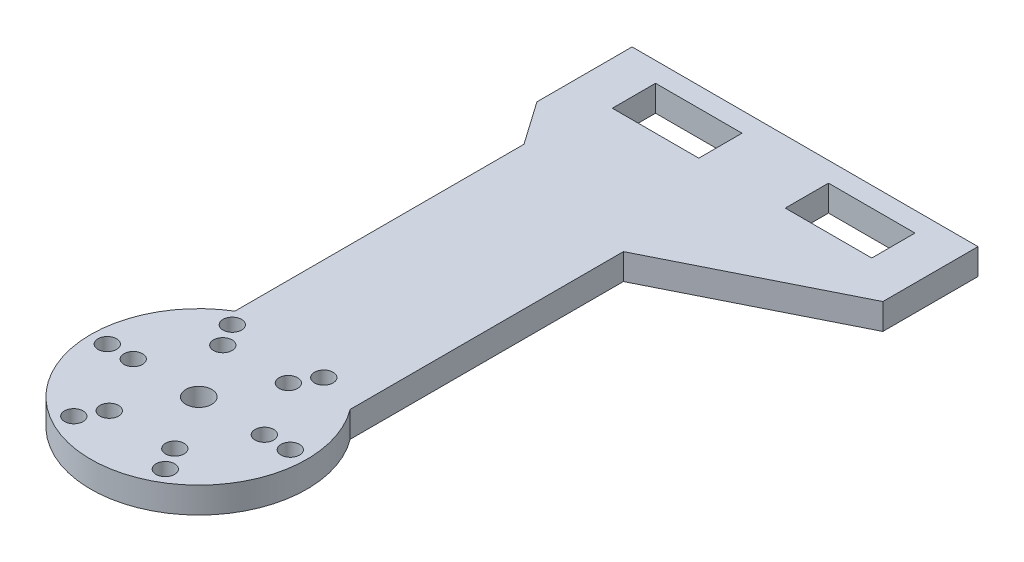
ISO-10303-21;
HEADER;
FILE_DESCRIPTION(('STEP AP214'),'2;1');
FILE_NAME('part.step','',(''),(''),'','','');
FILE_SCHEMA(('AUTOMOTIVE_DESIGN { 1 0 10303 214 1 1 1 1 }'));
ENDSEC;
DATA;
#1=APPLICATION_CONTEXT('core data for automotive mechanical design processes');
#2=APPLICATION_PROTOCOL_DEFINITION('international standard','automotive_design',2000,#1);
#3=PRODUCT_CONTEXT('',#1,'mechanical');
#4=PRODUCT('Part','Part','',(#3));
#5=PRODUCT_RELATED_PRODUCT_CATEGORY('part','',(#4));
#6=PRODUCT_DEFINITION_FORMATION('','',#4);
#7=PRODUCT_DEFINITION_CONTEXT('part definition',#1,'design');
#8=PRODUCT_DEFINITION('design','',#6,#7);
#9=PRODUCT_DEFINITION_SHAPE('','',#8);
#10=(LENGTH_UNIT() NAMED_UNIT(*) SI_UNIT(.MILLI.,.METRE.));
#11=(NAMED_UNIT(*) PLANE_ANGLE_UNIT() SI_UNIT($,.RADIAN.));
#12=(NAMED_UNIT(*) SI_UNIT($,.STERADIAN.) SOLID_ANGLE_UNIT());
#13=UNCERTAINTY_MEASURE_WITH_UNIT(LENGTH_MEASURE(1.E-05),#10,'distance_accuracy_value','');
#14=(GEOMETRIC_REPRESENTATION_CONTEXT(3) GLOBAL_UNCERTAINTY_ASSIGNED_CONTEXT((#13)) GLOBAL_UNIT_ASSIGNED_CONTEXT((#10,
#11,#12)) REPRESENTATION_CONTEXT('',''));
#15=CARTESIAN_POINT('',(0.,0.,0.));
#16=DIRECTION('',(0.,0.,1.));
#17=DIRECTION('',(1.,0.,0.));
#18=AXIS2_PLACEMENT_3D('',#15,#16,#17);
#19=CARTESIAN_POINT('',(0.,3.,0.));
#20=DIRECTION('',(0.,1.,0.));
#21=DIRECTION('',(0.,0.,1.));
#22=AXIS2_PLACEMENT_3D('',#19,#20,#21);
#23=PLANE('',#22);
#24=DIRECTION('',(0.,0.,1.));
#25=VECTOR('',#24,1.);
#26=CARTESIAN_POINT('',(15.,3.,-57.8141926587171));
#27=LINE('',#26,#25);
#28=CARTESIAN_POINT('',(15.,3.,-57.8141926587171));
#29=VERTEX_POINT('',#28);
#30=CARTESIAN_POINT('',(15.,3.,-52.8141926587171));
#31=VERTEX_POINT('',#30);
#32=EDGE_CURVE('E162',#29,#31,#27,.T.);
#33=ORIENTED_EDGE('',*,*,#32,.F.);
#34=DIRECTION('',(-1.,0.,0.));
#35=VECTOR('',#34,1.);
#36=CARTESIAN_POINT('',(25.,3.,-57.8141926587171));
#37=LINE('',#36,#35);
#38=CARTESIAN_POINT('',(25.,3.,-57.8141926587171));
#39=VERTEX_POINT('',#38);
#40=EDGE_CURVE('E153',#39,#29,#37,.T.);
#41=ORIENTED_EDGE('',*,*,#40,.F.);
#42=DIRECTION('',(0.,0.,-1.));
#43=VECTOR('',#42,1.);
#44=CARTESIAN_POINT('',(25.,3.,-52.8141926587171));
#45=LINE('',#44,#43);
#46=CARTESIAN_POINT('',(25.,3.,-52.8141926587171));
#47=VERTEX_POINT('',#46);
#48=EDGE_CURVE('E180',#47,#39,#45,.T.);
#49=ORIENTED_EDGE('',*,*,#48,.F.);
#50=DIRECTION('',(1.,0.,0.));
#51=VECTOR('',#50,1.);
#52=CARTESIAN_POINT('',(15.,3.,-52.8141926587171));
#53=LINE('',#52,#51);
#54=EDGE_CURVE('E176',#31,#47,#53,.T.);
#55=ORIENTED_EDGE('',*,*,#54,.F.);
#56=EDGE_LOOP('',(#33,#41,#49,#55));
#57=FACE_BOUND('',#56,.T.);
#58=DIRECTION('',(0.,0.,1.));
#59=VECTOR('',#58,1.);
#60=CARTESIAN_POINT('',(-5.00000000000001,3.,-57.8141926587171));
#61=LINE('',#60,#59);
#62=CARTESIAN_POINT('',(-5.00000000000001,3.,-57.8141926587171));
#63=VERTEX_POINT('',#62);
#64=CARTESIAN_POINT('',(-5.00000000000001,3.,-52.8141926587171));
#65=VERTEX_POINT('',#64);
#66=EDGE_CURVE('E207',#63,#65,#61,.T.);
#67=ORIENTED_EDGE('',*,*,#66,.F.);
#68=DIRECTION('',(-1.,0.,0.));
#69=VECTOR('',#68,1.);
#70=CARTESIAN_POINT('',(-5.00000000000001,3.,-57.8141926587171));
#71=LINE('',#70,#69);
#72=CARTESIAN_POINT('',(4.99999999999999,3.,-57.8141926587171));
#73=VERTEX_POINT('',#72);
#74=EDGE_CURVE('E204',#73,#63,#71,.T.);
#75=ORIENTED_EDGE('',*,*,#74,.F.);
#76=DIRECTION('',(0.,0.,-1.));
#77=VECTOR('',#76,1.);
#78=CARTESIAN_POINT('',(4.99999999999999,3.,-52.8141926587171));
#79=LINE('',#78,#77);
#80=CARTESIAN_POINT('',(4.99999999999999,3.,-52.8141926587171));
#81=VERTEX_POINT('',#80);
#82=EDGE_CURVE('E215',#81,#73,#79,.T.);
#83=ORIENTED_EDGE('',*,*,#82,.F.);
#84=DIRECTION('',(1.,0.,0.));
#85=VECTOR('',#84,1.);
#86=CARTESIAN_POINT('',(-5.00000000000001,3.,-52.8141926587171));
#87=LINE('',#86,#85);
#88=EDGE_CURVE('E211',#65,#81,#87,.T.);
#89=ORIENTED_EDGE('',*,*,#88,.F.);
#90=EDGE_LOOP('',(#67,#75,#83,#89));
#91=FACE_BOUND('',#90,.T.);
#92=CARTESIAN_POINT('',(3.79000000000008,3.,-6.564472560686));
#93=DIRECTION('',(0.,1.,0.));
#94=DIRECTION('',(0.,0.,1.));
#95=AXIS2_PLACEMENT_3D('',#92,#93,#94);
#96=CIRCLE('',#95,1.075);
#97=CARTESIAN_POINT('',(3.79000000000008,3.,-5.489472560686));
#98=VERTEX_POINT('',#97);
#99=EDGE_CURVE('E247',#98,#98,#96,.T.);
#100=ORIENTED_EDGE('',*,*,#99,.F.);
#101=EDGE_LOOP('',(#100));
#102=FACE_BOUND('',#101,.T.);
#103=CARTESIAN_POINT('',(-3.78999999999994,3.,-6.56447256068608));
#104=DIRECTION('',(0.,1.,0.));
#105=DIRECTION('',(0.,0.,1.));
#106=AXIS2_PLACEMENT_3D('',#103,#104,#105);
#107=CIRCLE('',#106,1.075);
#108=CARTESIAN_POINT('',(-3.78999999999994,3.,-5.48947256068608));
#109=VERTEX_POINT('',#108);
#110=EDGE_CURVE('E263',#109,#109,#107,.T.);
#111=ORIENTED_EDGE('',*,*,#110,.F.);
#112=EDGE_LOOP('',(#111));
#113=FACE_BOUND('',#112,.T.);
#114=CARTESIAN_POINT('',(-7.58,3.,0.));
#115=DIRECTION('',(0.,1.,0.));
#116=DIRECTION('',(0.,0.,1.));
#117=AXIS2_PLACEMENT_3D('',#114,#115,#116);
#118=CIRCLE('',#117,1.075);
#119=CARTESIAN_POINT('',(-7.58,3.,1.07499999999995));
#120=VERTEX_POINT('',#119);
#121=EDGE_CURVE('E279',#120,#120,#118,.T.);
#122=ORIENTED_EDGE('',*,*,#121,.F.);
#123=EDGE_LOOP('',(#122));
#124=FACE_BOUND('',#123,.T.);
#125=CARTESIAN_POINT('',(-3.79000000000003,3.,6.56447256068603));
#126=DIRECTION('',(0.,1.,0.));
#127=DIRECTION('',(0.,0.,1.));
#128=AXIS2_PLACEMENT_3D('',#125,#126,#127);
#129=CIRCLE('',#128,1.075);
#130=CARTESIAN_POINT('',(-3.79000000000003,3.,7.63947256068603));
#131=VERTEX_POINT('',#130);
#132=EDGE_CURVE('E295',#131,#131,#129,.T.);
#133=ORIENTED_EDGE('',*,*,#132,.F.);
#134=EDGE_LOOP('',(#133));
#135=FACE_BOUND('',#134,.T.);
#136=CARTESIAN_POINT('',(3.78999999999998,3.,6.56447256068606));
#137=DIRECTION('',(0.,1.,0.));
#138=DIRECTION('',(0.,0.,1.));
#139=AXIS2_PLACEMENT_3D('',#136,#137,#138);
#140=CIRCLE('',#139,1.075);
#141=CARTESIAN_POINT('',(3.78999999999998,3.,7.63947256068605));
#142=VERTEX_POINT('',#141);
#143=EDGE_CURVE('E311',#142,#142,#140,.T.);
#144=ORIENTED_EDGE('',*,*,#143,.F.);
#145=EDGE_LOOP('',(#144));
#146=FACE_BOUND('',#145,.T.);
#147=CARTESIAN_POINT('',(10.58,3.,0.));
#148=DIRECTION('',(0.,1.,0.));
#149=DIRECTION('',(0.,0.,1.));
#150=AXIS2_PLACEMENT_3D('',#147,#148,#149);
#151=CIRCLE('',#150,1.075);
#152=CARTESIAN_POINT('',(10.58,3.,1.075));
#153=VERTEX_POINT('',#152);
#154=EDGE_CURVE('E327',#153,#153,#151,.T.);
#155=ORIENTED_EDGE('',*,*,#154,.F.);
#156=EDGE_LOOP('',(#155));
#157=FACE_BOUND('',#156,.T.);
#158=CARTESIAN_POINT('',(0.,3.,0.));
#159=DIRECTION('',(0.,1.,0.));
#160=DIRECTION('',(0.,0.,1.));
#161=AXIS2_PLACEMENT_3D('',#158,#159,#160);
#162=CIRCLE('',#161,12.5);
#163=CARTESIAN_POINT('',(-6.50000000000001,3.,-10.6770782520313));
#164=VERTEX_POINT('',#163);
#165=CARTESIAN_POINT('',(9.99999999999999,3.,-7.50000000000001));
#166=VERTEX_POINT('',#165);
#167=EDGE_CURVE('E343',#164,#166,#162,.T.);
#168=ORIENTED_EDGE('',*,*,#167,.T.);
#169=DIRECTION('',(0.,0.,-1.));
#170=VECTOR('',#169,1.);
#171=CARTESIAN_POINT('',(9.99999999999999,3.,-7.50000000000001));
#172=LINE('',#171,#170);
#173=CARTESIAN_POINT('',(9.99999999999999,3.,-39.1));
#174=VERTEX_POINT('',#173);
#175=EDGE_CURVE('E347',#166,#174,#172,.T.);
#176=ORIENTED_EDGE('',*,*,#175,.T.);
#177=DIRECTION('',(0.894427190999916,0.,-0.447213595499958));
#178=VECTOR('',#177,1.);
#179=CARTESIAN_POINT('',(30.,3.,-49.1));
#180=LINE('',#179,#178);
#181=CARTESIAN_POINT('',(30.,3.,-49.1));
#182=VERTEX_POINT('',#181);
#183=EDGE_CURVE('E351',#174,#182,#180,.T.);
#184=ORIENTED_EDGE('',*,*,#183,.T.);
#185=DIRECTION('',(0.,0.,-1.));
#186=VECTOR('',#185,1.);
#187=CARTESIAN_POINT('',(30.,3.,-60.1));
#188=LINE('',#187,#186);
#189=CARTESIAN_POINT('',(30.,3.,-60.1));
#190=VERTEX_POINT('',#189);
#191=EDGE_CURVE('E354',#182,#190,#188,.T.);
#192=ORIENTED_EDGE('',*,*,#191,.T.);
#193=DIRECTION('',(-1.,0.,0.));
#194=VECTOR('',#193,1.);
#195=CARTESIAN_POINT('',(-10.,3.,-60.1));
#196=LINE('',#195,#194);
#197=CARTESIAN_POINT('',(-10.,3.,-60.1));
#198=VERTEX_POINT('',#197);
#199=EDGE_CURVE('E357',#190,#198,#196,.T.);
#200=ORIENTED_EDGE('',*,*,#199,.T.);
#201=DIRECTION('',(0.,0.,1.));
#202=VECTOR('',#201,1.);
#203=CARTESIAN_POINT('',(-10.,3.,-49.0985180235974));
#204=LINE('',#203,#202);
#205=CARTESIAN_POINT('',(-10.,3.,-49.0985180235974));
#206=VERTEX_POINT('',#205);
#207=EDGE_CURVE('E360',#198,#206,#204,.T.);
#208=ORIENTED_EDGE('',*,*,#207,.T.);
#209=DIRECTION('',(0.573576436351047,0.,0.819152044288991));
#210=VECTOR('',#209,1.);
#211=CARTESIAN_POINT('',(-6.50000000000001,3.,-44.1));
#212=LINE('',#211,#210);
#213=CARTESIAN_POINT('',(-6.50000000000001,3.,-44.1));
#214=VERTEX_POINT('',#213);
#215=EDGE_CURVE('E363',#206,#214,#212,.T.);
#216=ORIENTED_EDGE('',*,*,#215,.T.);
#217=DIRECTION('',(0.,0.,1.));
#218=VECTOR('',#217,1.);
#219=CARTESIAN_POINT('',(-6.50000000000001,3.,-10.6770782520313));
#220=LINE('',#219,#218);
#221=EDGE_CURVE('E366',#214,#164,#220,.T.);
#222=ORIENTED_EDGE('',*,*,#221,.T.);
#223=EDGE_LOOP('',(#168,#176,#184,#192,#200,#208,#216,#222));
#224=FACE_BOUND('',#223,.T.);
#225=CARTESIAN_POINT('',(7.58,3.,0.));
#226=DIRECTION('',(0.,1.,0.));
#227=DIRECTION('',(0.,0.,1.));
#228=AXIS2_PLACEMENT_3D('',#225,#226,#227);
#229=CIRCLE('',#228,1.075);
#230=CARTESIAN_POINT('',(7.58,3.,1.075));
#231=VERTEX_POINT('',#230);
#232=EDGE_CURVE('E335',#231,#231,#229,.T.);
#233=ORIENTED_EDGE('',*,*,#232,.F.);
#234=EDGE_LOOP('',(#233));
#235=FACE_BOUND('',#234,.T.);
#236=CARTESIAN_POINT('',(0.,3.,0.));
#237=DIRECTION('',(0.,1.,0.));
#238=DIRECTION('',(0.,0.,1.));
#239=AXIS2_PLACEMENT_3D('',#236,#237,#238);
#240=CIRCLE('',#239,1.5);
#241=CARTESIAN_POINT('',(0.,3.,1.5));
#242=VERTEX_POINT('',#241);
#243=EDGE_CURVE('E319',#242,#242,#240,.T.);
#244=ORIENTED_EDGE('',*,*,#243,.F.);
#245=EDGE_LOOP('',(#244));
#246=FACE_BOUND('',#245,.T.);
#247=CARTESIAN_POINT('',(5.28999999999998,3.,9.16254877203937));
#248=DIRECTION('',(0.,1.,0.));
#249=DIRECTION('',(0.,0.,1.));
#250=AXIS2_PLACEMENT_3D('',#247,#248,#249);
#251=CIRCLE('',#250,1.075);
#252=CARTESIAN_POINT('',(5.28999999999998,3.,10.2375487720394));
#253=VERTEX_POINT('',#252);
#254=EDGE_CURVE('E303',#253,#253,#251,.T.);
#255=ORIENTED_EDGE('',*,*,#254,.F.);
#256=EDGE_LOOP('',(#255));
#257=FACE_BOUND('',#256,.T.);
#258=CARTESIAN_POINT('',(-5.29000000000004,3.,9.16254877203934));
#259=DIRECTION('',(0.,1.,0.));
#260=DIRECTION('',(0.,0.,1.));
#261=AXIS2_PLACEMENT_3D('',#258,#259,#260);
#262=CIRCLE('',#261,1.075);
#263=CARTESIAN_POINT('',(-5.29000000000004,3.,10.2375487720393));
#264=VERTEX_POINT('',#263);
#265=EDGE_CURVE('E287',#264,#264,#262,.T.);
#266=ORIENTED_EDGE('',*,*,#265,.F.);
#267=EDGE_LOOP('',(#266));
#268=FACE_BOUND('',#267,.T.);
#269=CARTESIAN_POINT('',(-10.58,3.,0.));
#270=DIRECTION('',(0.,1.,0.));
#271=DIRECTION('',(0.,0.,1.));
#272=AXIS2_PLACEMENT_3D('',#269,#270,#271);
#273=CIRCLE('',#272,1.075);
#274=CARTESIAN_POINT('',(-10.58,3.,1.07499999999992));
#275=VERTEX_POINT('',#274);
#276=EDGE_CURVE('E271',#275,#275,#273,.T.);
#277=ORIENTED_EDGE('',*,*,#276,.F.);
#278=EDGE_LOOP('',(#277));
#279=FACE_BOUND('',#278,.T.);
#280=CARTESIAN_POINT('',(-5.28999999999991,3.,-9.16254877203941));
#281=DIRECTION('',(0.,1.,0.));
#282=DIRECTION('',(0.,0.,1.));
#283=AXIS2_PLACEMENT_3D('',#280,#281,#282);
#284=CIRCLE('',#283,1.075);
#285=CARTESIAN_POINT('',(-5.28999999999991,3.,-8.08754877203941));
#286=VERTEX_POINT('',#285);
#287=EDGE_CURVE('E255',#286,#286,#284,.T.);
#288=ORIENTED_EDGE('',*,*,#287,.F.);
#289=EDGE_LOOP('',(#288));
#290=FACE_BOUND('',#289,.T.);
#291=CARTESIAN_POINT('',(5.29000000000011,3.,-9.1625487720393));
#292=DIRECTION('',(0.,1.,0.));
#293=DIRECTION('',(0.,0.,1.));
#294=AXIS2_PLACEMENT_3D('',#291,#292,#293);
#295=CIRCLE('',#294,1.075);
#296=CARTESIAN_POINT('',(5.29000000000011,3.,-8.0875487720393));
#297=VERTEX_POINT('',#296);
#298=EDGE_CURVE('E188',#297,#297,#295,.T.);
#299=ORIENTED_EDGE('',*,*,#298,.F.);
#300=EDGE_LOOP('',(#299));
#301=FACE_BOUND('',#300,.T.);
#302=ADVANCED_FACE('F39',(#57,#91,#102,#113,#124,#135,#146,#157,#224,#235,#246,#257,#268,#279,
#290,#301),#23,.T.);
#303=CARTESIAN_POINT('',(0.,0.,0.));
#304=DIRECTION('',(0.,1.,0.));
#305=DIRECTION('',(0.,0.,1.));
#306=AXIS2_PLACEMENT_3D('',#303,#304,#305);
#307=PLANE('',#306);
#308=DIRECTION('',(-1.,0.,0.));
#309=VECTOR('',#308,1.);
#310=CARTESIAN_POINT('',(-5.00000000000001,0.,-57.8141926587171));
#311=LINE('',#310,#309);
#312=CARTESIAN_POINT('',(4.99999999999999,0.,-57.8141926587171));
#313=VERTEX_POINT('',#312);
#314=CARTESIAN_POINT('',(-5.00000000000001,0.,-57.8141926587171));
#315=VERTEX_POINT('',#314);
#316=EDGE_CURVE('E171',#313,#315,#311,.T.);
#317=ORIENTED_EDGE('',*,*,#316,.T.);
#318=DIRECTION('',(0.,0.,1.));
#319=VECTOR('',#318,1.);
#320=CARTESIAN_POINT('',(-5.00000000000001,0.,-57.8141926587171));
#321=LINE('',#320,#319);
#322=CARTESIAN_POINT('',(-5.00000000000001,0.,-52.8141926587171));
#323=VERTEX_POINT('',#322);
#324=EDGE_CURVE('E222',#315,#323,#321,.T.);
#325=ORIENTED_EDGE('',*,*,#324,.T.);
#326=DIRECTION('',(1.,0.,0.));
#327=VECTOR('',#326,1.);
#328=CARTESIAN_POINT('',(-5.00000000000001,0.,-52.8141926587171));
#329=LINE('',#328,#327);
#330=CARTESIAN_POINT('',(4.99999999999999,0.,-52.8141926587171));
#331=VERTEX_POINT('',#330);
#332=EDGE_CURVE('E226',#323,#331,#329,.T.);
#333=ORIENTED_EDGE('',*,*,#332,.T.);
#334=DIRECTION('',(0.,0.,-1.));
#335=VECTOR('',#334,1.);
#336=CARTESIAN_POINT('',(4.99999999999999,0.,-52.8141926587171));
#337=LINE('',#336,#335);
#338=EDGE_CURVE('E208',#331,#313,#337,.T.);
#339=ORIENTED_EDGE('',*,*,#338,.T.);
#340=EDGE_LOOP('',(#317,#325,#333,#339));
#341=FACE_BOUND('',#340,.T.);
#342=CARTESIAN_POINT('',(0.,0.,0.));
#343=DIRECTION('',(0.,1.,0.));
#344=DIRECTION('',(0.,0.,1.));
#345=AXIS2_PLACEMENT_3D('',#342,#343,#344);
#346=CIRCLE('',#345,12.5);
#347=CARTESIAN_POINT('',(-6.50000000000001,0.,-10.6770782520313));
#348=VERTEX_POINT('',#347);
#349=CARTESIAN_POINT('',(9.99999999999999,0.,-7.50000000000001));
#350=VERTEX_POINT('',#349);
#351=EDGE_CURVE('E339',#348,#350,#346,.T.);
#352=ORIENTED_EDGE('',*,*,#351,.F.);
#353=DIRECTION('',(0.,0.,1.));
#354=VECTOR('',#353,1.);
#355=CARTESIAN_POINT('',(-6.50000000000001,0.,-10.6770782520313));
#356=LINE('',#355,#354);
#357=CARTESIAN_POINT('',(-6.50000000000001,0.,-44.1));
#358=VERTEX_POINT('',#357);
#359=EDGE_CURVE('E348',#358,#348,#356,.T.);
#360=ORIENTED_EDGE('',*,*,#359,.F.);
#361=DIRECTION('',(0.573576436351047,0.,0.819152044288991));
#362=VECTOR('',#361,1.);
#363=CARTESIAN_POINT('',(-6.50000000000001,0.,-44.1));
#364=LINE('',#363,#362);
#365=CARTESIAN_POINT('',(-10.,0.,-49.0985180235974));
#366=VERTEX_POINT('',#365);
#367=EDGE_CURVE('E388',#366,#358,#364,.T.);
#368=ORIENTED_EDGE('',*,*,#367,.F.);
#369=DIRECTION('',(0.,0.,1.));
#370=VECTOR('',#369,1.);
#371=CARTESIAN_POINT('',(-10.,0.,-49.0985180235974));
#372=LINE('',#371,#370);
#373=CARTESIAN_POINT('',(-10.,0.,-60.1));
#374=VERTEX_POINT('',#373);
#375=EDGE_CURVE('E385',#374,#366,#372,.T.);
#376=ORIENTED_EDGE('',*,*,#375,.F.);
#377=DIRECTION('',(-1.,0.,0.));
#378=VECTOR('',#377,1.);
#379=CARTESIAN_POINT('',(-10.,0.,-60.1));
#380=LINE('',#379,#378);
#381=CARTESIAN_POINT('',(30.,0.,-60.1));
#382=VERTEX_POINT('',#381);
#383=EDGE_CURVE('E382',#382,#374,#380,.T.);
#384=ORIENTED_EDGE('',*,*,#383,.F.);
#385=DIRECTION('',(0.,0.,-1.));
#386=VECTOR('',#385,1.);
#387=CARTESIAN_POINT('',(30.,0.,-60.1));
#388=LINE('',#387,#386);
#389=CARTESIAN_POINT('',(30.,0.,-49.1));
#390=VERTEX_POINT('',#389);
#391=EDGE_CURVE('E379',#390,#382,#388,.T.);
#392=ORIENTED_EDGE('',*,*,#391,.F.);
#393=DIRECTION('',(0.894427190999916,0.,-0.447213595499958));
#394=VECTOR('',#393,1.);
#395=CARTESIAN_POINT('',(30.,0.,-49.1));
#396=LINE('',#395,#394);
#397=CARTESIAN_POINT('',(9.99999999999999,0.,-39.1));
#398=VERTEX_POINT('',#397);
#399=EDGE_CURVE('E376',#398,#390,#396,.T.);
#400=ORIENTED_EDGE('',*,*,#399,.F.);
#401=DIRECTION('',(0.,0.,-1.));
#402=VECTOR('',#401,1.);
#403=CARTESIAN_POINT('',(9.99999999999999,0.,-7.50000000000001));
#404=LINE('',#403,#402);
#405=EDGE_CURVE('E373',#350,#398,#404,.T.);
#406=ORIENTED_EDGE('',*,*,#405,.F.);
#407=EDGE_LOOP('',(#352,#360,#368,#376,#384,#392,#400,#406));
#408=FACE_BOUND('',#407,.T.);
#409=CARTESIAN_POINT('',(7.58,0.,0.));
#410=DIRECTION('',(0.,1.,0.));
#411=DIRECTION('',(0.,0.,1.));
#412=AXIS2_PLACEMENT_3D('',#409,#410,#411);
#413=CIRCLE('',#412,1.075);
#414=CARTESIAN_POINT('',(7.58,0.,1.075));
#415=VERTEX_POINT('',#414);
#416=EDGE_CURVE('E331',#415,#415,#413,.T.);
#417=ORIENTED_EDGE('',*,*,#416,.T.);
#418=EDGE_LOOP('',(#417));
#419=FACE_BOUND('',#418,.T.);
#420=CARTESIAN_POINT('',(10.58,0.,0.));
#421=DIRECTION('',(0.,1.,0.));
#422=DIRECTION('',(0.,0.,1.));
#423=AXIS2_PLACEMENT_3D('',#420,#421,#422);
#424=CIRCLE('',#423,1.075);
#425=CARTESIAN_POINT('',(10.58,0.,1.075));
#426=VERTEX_POINT('',#425);
#427=EDGE_CURVE('E323',#426,#426,#424,.T.);
#428=ORIENTED_EDGE('',*,*,#427,.T.);
#429=EDGE_LOOP('',(#428));
#430=FACE_BOUND('',#429,.T.);
#431=CARTESIAN_POINT('',(0.,0.,0.));
#432=DIRECTION('',(0.,1.,0.));
#433=DIRECTION('',(0.,0.,1.));
#434=AXIS2_PLACEMENT_3D('',#431,#432,#433);
#435=CIRCLE('',#434,1.5);
#436=CARTESIAN_POINT('',(0.,0.,1.5));
#437=VERTEX_POINT('',#436);
#438=EDGE_CURVE('E315',#437,#437,#435,.T.);
#439=ORIENTED_EDGE('',*,*,#438,.T.);
#440=EDGE_LOOP('',(#439));
#441=FACE_BOUND('',#440,.T.);
#442=CARTESIAN_POINT('',(3.78999999999998,0.,6.56447256068606));
#443=DIRECTION('',(0.,1.,0.));
#444=DIRECTION('',(0.,0.,1.));
#445=AXIS2_PLACEMENT_3D('',#442,#443,#444);
#446=CIRCLE('',#445,1.075);
#447=CARTESIAN_POINT('',(3.78999999999998,0.,7.63947256068605));
#448=VERTEX_POINT('',#447);
#449=EDGE_CURVE('E307',#448,#448,#446,.T.);
#450=ORIENTED_EDGE('',*,*,#449,.T.);
#451=EDGE_LOOP('',(#450));
#452=FACE_BOUND('',#451,.T.);
#453=CARTESIAN_POINT('',(5.28999999999998,0.,9.16254877203937));
#454=DIRECTION('',(0.,1.,0.));
#455=DIRECTION('',(0.,0.,1.));
#456=AXIS2_PLACEMENT_3D('',#453,#454,#455);
#457=CIRCLE('',#456,1.075);
#458=CARTESIAN_POINT('',(5.28999999999998,0.,10.2375487720394));
#459=VERTEX_POINT('',#458);
#460=EDGE_CURVE('E299',#459,#459,#457,.T.);
#461=ORIENTED_EDGE('',*,*,#460,.T.);
#462=EDGE_LOOP('',(#461));
#463=FACE_BOUND('',#462,.T.);
#464=CARTESIAN_POINT('',(-3.79000000000003,0.,6.56447256068603));
#465=DIRECTION('',(0.,1.,0.));
#466=DIRECTION('',(0.,0.,1.));
#467=AXIS2_PLACEMENT_3D('',#464,#465,#466);
#468=CIRCLE('',#467,1.075);
#469=CARTESIAN_POINT('',(-3.79000000000003,0.,7.63947256068603));
#470=VERTEX_POINT('',#469);
#471=EDGE_CURVE('E291',#470,#470,#468,.T.);
#472=ORIENTED_EDGE('',*,*,#471,.T.);
#473=EDGE_LOOP('',(#472));
#474=FACE_BOUND('',#473,.T.);
#475=CARTESIAN_POINT('',(-5.29000000000004,0.,9.16254877203934));
#476=DIRECTION('',(0.,1.,0.));
#477=DIRECTION('',(0.,0.,1.));
#478=AXIS2_PLACEMENT_3D('',#475,#476,#477);
#479=CIRCLE('',#478,1.075);
#480=CARTESIAN_POINT('',(-5.29000000000004,0.,10.2375487720393));
#481=VERTEX_POINT('',#480);
#482=EDGE_CURVE('E283',#481,#481,#479,.T.);
#483=ORIENTED_EDGE('',*,*,#482,.T.);
#484=EDGE_LOOP('',(#483));
#485=FACE_BOUND('',#484,.T.);
#486=CARTESIAN_POINT('',(-7.58,0.,0.));
#487=DIRECTION('',(0.,1.,0.));
#488=DIRECTION('',(0.,0.,1.));
#489=AXIS2_PLACEMENT_3D('',#486,#487,#488);
#490=CIRCLE('',#489,1.075);
#491=CARTESIAN_POINT('',(-7.58,0.,1.07499999999995));
#492=VERTEX_POINT('',#491);
#493=EDGE_CURVE('E275',#492,#492,#490,.T.);
#494=ORIENTED_EDGE('',*,*,#493,.T.);
#495=EDGE_LOOP('',(#494));
#496=FACE_BOUND('',#495,.T.);
#497=CARTESIAN_POINT('',(-10.58,0.,0.));
#498=DIRECTION('',(0.,1.,0.));
#499=DIRECTION('',(0.,0.,1.));
#500=AXIS2_PLACEMENT_3D('',#497,#498,#499);
#501=CIRCLE('',#500,1.075);
#502=CARTESIAN_POINT('',(-10.58,0.,1.07499999999992));
#503=VERTEX_POINT('',#502);
#504=EDGE_CURVE('E267',#503,#503,#501,.T.);
#505=ORIENTED_EDGE('',*,*,#504,.T.);
#506=EDGE_LOOP('',(#505));
#507=FACE_BOUND('',#506,.T.);
#508=CARTESIAN_POINT('',(-3.78999999999994,0.,-6.56447256068608));
#509=DIRECTION('',(0.,1.,0.));
#510=DIRECTION('',(0.,0.,1.));
#511=AXIS2_PLACEMENT_3D('',#508,#509,#510);
#512=CIRCLE('',#511,1.075);
#513=CARTESIAN_POINT('',(-3.78999999999994,0.,-5.48947256068608));
#514=VERTEX_POINT('',#513);
#515=EDGE_CURVE('E259',#514,#514,#512,.T.);
#516=ORIENTED_EDGE('',*,*,#515,.T.);
#517=EDGE_LOOP('',(#516));
#518=FACE_BOUND('',#517,.T.);
#519=CARTESIAN_POINT('',(-5.28999999999991,0.,-9.16254877203941));
#520=DIRECTION('',(0.,1.,0.));
#521=DIRECTION('',(0.,0.,1.));
#522=AXIS2_PLACEMENT_3D('',#519,#520,#521);
#523=CIRCLE('',#522,1.075);
#524=CARTESIAN_POINT('',(-5.28999999999991,0.,-8.08754877203941));
#525=VERTEX_POINT('',#524);
#526=EDGE_CURVE('E251',#525,#525,#523,.T.);
#527=ORIENTED_EDGE('',*,*,#526,.T.);
#528=EDGE_LOOP('',(#527));
#529=FACE_BOUND('',#528,.T.);
#530=CARTESIAN_POINT('',(3.79000000000008,0.,-6.564472560686));
#531=DIRECTION('',(0.,1.,0.));
#532=DIRECTION('',(0.,0.,1.));
#533=AXIS2_PLACEMENT_3D('',#530,#531,#532);
#534=CIRCLE('',#533,1.075);
#535=CARTESIAN_POINT('',(3.79000000000008,0.,-5.489472560686));
#536=VERTEX_POINT('',#535);
#537=EDGE_CURVE('E246',#536,#536,#534,.T.);
#538=ORIENTED_EDGE('',*,*,#537,.T.);
#539=EDGE_LOOP('',(#538));
#540=FACE_BOUND('',#539,.T.);
#541=DIRECTION('',(-1.,0.,0.));
#542=VECTOR('',#541,1.);
#543=CARTESIAN_POINT('',(25.,0.,-57.8141926587171));
#544=LINE('',#543,#542);
#545=CARTESIAN_POINT('',(25.,0.,-57.8141926587171));
#546=VERTEX_POINT('',#545);
#547=CARTESIAN_POINT('',(15.,0.,-57.8141926587171));
#548=VERTEX_POINT('',#547);
#549=EDGE_CURVE('E63',#546,#548,#544,.T.);
#550=ORIENTED_EDGE('',*,*,#549,.T.);
#551=DIRECTION('',(0.,0.,1.));
#552=VECTOR('',#551,1.);
#553=CARTESIAN_POINT('',(15.,0.,-57.8141926587171));
#554=LINE('',#553,#552);
#555=CARTESIAN_POINT('',(15.,0.,-52.8141926587171));
#556=VERTEX_POINT('',#555);
#557=EDGE_CURVE('E169',#548,#556,#554,.T.);
#558=ORIENTED_EDGE('',*,*,#557,.T.);
#559=DIRECTION('',(1.,0.,0.));
#560=VECTOR('',#559,1.);
#561=CARTESIAN_POINT('',(15.,0.,-52.8141926587171));
#562=LINE('',#561,#560);
#563=CARTESIAN_POINT('',(25.,0.,-52.8141926587171));
#564=VERTEX_POINT('',#563);
#565=EDGE_CURVE('E191',#556,#564,#562,.T.);
#566=ORIENTED_EDGE('',*,*,#565,.T.);
#567=DIRECTION('',(0.,0.,-1.));
#568=VECTOR('',#567,1.);
#569=CARTESIAN_POINT('',(25.,0.,-52.8141926587171));
#570=LINE('',#569,#568);
#571=EDGE_CURVE('E163',#564,#546,#570,.T.);
#572=ORIENTED_EDGE('',*,*,#571,.T.);
#573=EDGE_LOOP('',(#550,#558,#566,#572));
#574=FACE_BOUND('',#573,.T.);
#575=CARTESIAN_POINT('',(5.29000000000011,0.,-9.1625487720393));
#576=DIRECTION('',(0.,1.,0.));
#577=DIRECTION('',(0.,0.,1.));
#578=AXIS2_PLACEMENT_3D('',#575,#576,#577);
#579=CIRCLE('',#578,1.075);
#580=CARTESIAN_POINT('',(5.29000000000011,0.,-8.0875487720393));
#581=VERTEX_POINT('',#580);
#582=EDGE_CURVE('E518',#581,#581,#579,.T.);
#583=ORIENTED_EDGE('',*,*,#582,.T.);
#584=EDGE_LOOP('',(#583));
#585=FACE_BOUND('',#584,.T.);
#586=ADVANCED_FACE('F427',(#341,#408,#419,#430,#441,#452,#463,#474,#485,#496,#507,#518,#529,
#540,#574,#585),#307,.F.);
#587=CARTESIAN_POINT('',(0.,3.,0.));
#588=DIRECTION('',(0.,-1.,0.));
#589=DIRECTION('',(0.,0.,-1.));
#590=AXIS2_PLACEMENT_3D('',#587,#588,#589);
#591=CYLINDRICAL_SURFACE('',#590,12.5);
#592=ORIENTED_EDGE('',*,*,#351,.T.);
#593=DIRECTION('',(0.,-1.,0.));
#594=VECTOR('',#593,1.);
#595=CARTESIAN_POINT('',(9.99999999999999,3.,-7.50000000000001));
#596=LINE('',#595,#594);
#597=EDGE_CURVE('E11',#166,#350,#596,.T.);
#598=ORIENTED_EDGE('',*,*,#597,.F.);
#599=ORIENTED_EDGE('',*,*,#167,.F.);
#600=DIRECTION('',(0.,-1.,0.));
#601=VECTOR('',#600,1.);
#602=CARTESIAN_POINT('',(-6.50000000000001,3.,-10.6770782520313));
#603=LINE('',#602,#601);
#604=EDGE_CURVE('E369',#164,#348,#603,.T.);
#605=ORIENTED_EDGE('',*,*,#604,.T.);
#606=EDGE_LOOP('',(#592,#598,#599,#605));
#607=FACE_BOUND('',#606,.T.);
#608=ADVANCED_FACE('F41',(#607),#591,.T.);
#609=CARTESIAN_POINT('',(9.99999999999999,3.,-7.50000000000001));
#610=DIRECTION('',(-1.,0.,0.));
#611=DIRECTION('',(0.,0.,1.));
#612=AXIS2_PLACEMENT_3D('',#609,#610,#611);
#613=PLANE('',#612);
#614=ORIENTED_EDGE('',*,*,#405,.T.);
#615=DIRECTION('',(0.,-1.,0.));
#616=VECTOR('',#615,1.);
#617=CARTESIAN_POINT('',(9.99999999999999,3.,-39.1));
#618=LINE('',#617,#616);
#619=EDGE_CURVE('E48',#174,#398,#618,.T.);
#620=ORIENTED_EDGE('',*,*,#619,.F.);
#621=ORIENTED_EDGE('',*,*,#175,.F.);
#622=ORIENTED_EDGE('',*,*,#597,.T.);
#623=EDGE_LOOP('',(#614,#620,#621,#622));
#624=FACE_BOUND('',#623,.T.);
#625=ADVANCED_FACE('F445',(#624),#613,.F.);
#626=CARTESIAN_POINT('',(30.,3.,-49.1));
#627=DIRECTION('',(-0.447213595499958,0.,-0.894427190999916));
#628=DIRECTION('',(-0.894427190999916,0.,0.447213595499958));
#629=AXIS2_PLACEMENT_3D('',#626,#627,#628);
#630=PLANE('',#629);
#631=ORIENTED_EDGE('',*,*,#399,.T.);
#632=DIRECTION('',(0.,-1.,0.));
#633=VECTOR('',#632,1.);
#634=CARTESIAN_POINT('',(30.,3.,-49.1));
#635=LINE('',#634,#633);
#636=EDGE_CURVE('E412',#182,#390,#635,.T.);
#637=ORIENTED_EDGE('',*,*,#636,.F.);
#638=ORIENTED_EDGE('',*,*,#183,.F.);
#639=ORIENTED_EDGE('',*,*,#619,.T.);
#640=EDGE_LOOP('',(#631,#637,#638,#639));
#641=FACE_BOUND('',#640,.T.);
#642=ADVANCED_FACE('F421',(#641),#630,.F.);
#643=CARTESIAN_POINT('',(30.,3.,-60.1));
#644=DIRECTION('',(-1.,0.,0.));
#645=DIRECTION('',(0.,0.,1.));
#646=AXIS2_PLACEMENT_3D('',#643,#644,#645);
#647=PLANE('',#646);
#648=ORIENTED_EDGE('',*,*,#391,.T.);
#649=DIRECTION('',(0.,-1.,0.));
#650=VECTOR('',#649,1.);
#651=CARTESIAN_POINT('',(30.,3.,-60.1));
#652=LINE('',#651,#650);
#653=EDGE_CURVE('E408',#190,#382,#652,.T.);
#654=ORIENTED_EDGE('',*,*,#653,.F.);
#655=ORIENTED_EDGE('',*,*,#191,.F.);
#656=ORIENTED_EDGE('',*,*,#636,.T.);
#657=EDGE_LOOP('',(#648,#654,#655,#656));
#658=FACE_BOUND('',#657,.T.);
#659=ADVANCED_FACE('F433',(#658),#647,.F.);
#660=CARTESIAN_POINT('',(-10.,3.,-60.1));
#661=DIRECTION('',(0.,0.,1.));
#662=DIRECTION('',(1.,0.,0.));
#663=AXIS2_PLACEMENT_3D('',#660,#661,#662);
#664=PLANE('',#663);
#665=ORIENTED_EDGE('',*,*,#383,.T.);
#666=DIRECTION('',(0.,-1.,0.));
#667=VECTOR('',#666,1.);
#668=CARTESIAN_POINT('',(-10.,3.,-60.1));
#669=LINE('',#668,#667);
#670=EDGE_CURVE('E404',#198,#374,#669,.T.);
#671=ORIENTED_EDGE('',*,*,#670,.F.);
#672=ORIENTED_EDGE('',*,*,#199,.F.);
#673=ORIENTED_EDGE('',*,*,#653,.T.);
#674=EDGE_LOOP('',(#665,#671,#672,#673));
#675=FACE_BOUND('',#674,.T.);
#676=ADVANCED_FACE('F437',(#675),#664,.F.);
#677=CARTESIAN_POINT('',(-10.,3.,-49.0985180235974));
#678=DIRECTION('',(1.,0.,0.));
#679=DIRECTION('',(0.,0.,-1.));
#680=AXIS2_PLACEMENT_3D('',#677,#678,#679);
#681=PLANE('',#680);
#682=ORIENTED_EDGE('',*,*,#375,.T.);
#683=DIRECTION('',(0.,-1.,0.));
#684=VECTOR('',#683,1.);
#685=CARTESIAN_POINT('',(-10.,3.,-49.0985180235974));
#686=LINE('',#685,#684);
#687=EDGE_CURVE('E400',#206,#366,#686,.T.);
#688=ORIENTED_EDGE('',*,*,#687,.F.);
#689=ORIENTED_EDGE('',*,*,#207,.F.);
#690=ORIENTED_EDGE('',*,*,#670,.T.);
#691=EDGE_LOOP('',(#682,#688,#689,#690));
#692=FACE_BOUND('',#691,.T.);
#693=ADVANCED_FACE('F458',(#692),#681,.F.);
#694=CARTESIAN_POINT('',(-6.50000000000001,3.,-44.1));
#695=DIRECTION('',(0.819152044288991,0.,-0.573576436351047));
#696=DIRECTION('',(-0.573576436351047,0.,-0.819152044288991));
#697=AXIS2_PLACEMENT_3D('',#694,#695,#696);
#698=PLANE('',#697);
#699=ORIENTED_EDGE('',*,*,#367,.T.);
#700=DIRECTION('',(0.,-1.,0.));
#701=VECTOR('',#700,1.);
#702=CARTESIAN_POINT('',(-6.50000000000001,3.,-44.1));
#703=LINE('',#702,#701);
#704=EDGE_CURVE('E396',#214,#358,#703,.T.);
#705=ORIENTED_EDGE('',*,*,#704,.F.);
#706=ORIENTED_EDGE('',*,*,#215,.F.);
#707=ORIENTED_EDGE('',*,*,#687,.T.);
#708=EDGE_LOOP('',(#699,#705,#706,#707));
#709=FACE_BOUND('',#708,.T.);
#710=ADVANCED_FACE('F456',(#709),#698,.F.);
#711=CARTESIAN_POINT('',(-6.50000000000001,3.,-10.6770782520313));
#712=DIRECTION('',(1.,0.,0.));
#713=DIRECTION('',(0.,0.,-1.));
#714=AXIS2_PLACEMENT_3D('',#711,#712,#713);
#715=PLANE('',#714);
#716=ORIENTED_EDGE('',*,*,#359,.T.);
#717=ORIENTED_EDGE('',*,*,#604,.F.);
#718=ORIENTED_EDGE('',*,*,#221,.F.);
#719=ORIENTED_EDGE('',*,*,#704,.T.);
#720=EDGE_LOOP('',(#716,#717,#718,#719));
#721=FACE_BOUND('',#720,.T.);
#722=ADVANCED_FACE('F451',(#721),#715,.F.);
#723=CARTESIAN_POINT('',(7.58,3.,0.));
#724=DIRECTION('',(0.,-1.,0.));
#725=DIRECTION('',(0.,0.,-1.));
#726=AXIS2_PLACEMENT_3D('',#723,#724,#725);
#727=CYLINDRICAL_SURFACE('',#726,1.075);
#728=ORIENTED_EDGE('',*,*,#232,.T.);
#729=EDGE_LOOP('',(#728));
#730=FACE_BOUND('',#729,.T.);
#731=ORIENTED_EDGE('',*,*,#416,.F.);
#732=EDGE_LOOP('',(#731));
#733=FACE_BOUND('',#732,.T.);
#734=ADVANCED_FACE('F475',(#730,#733),#727,.F.);
#735=CARTESIAN_POINT('',(10.58,3.,0.));
#736=DIRECTION('',(0.,-1.,0.));
#737=DIRECTION('',(0.,0.,-1.));
#738=AXIS2_PLACEMENT_3D('',#735,#736,#737);
#739=CYLINDRICAL_SURFACE('',#738,1.075);
#740=ORIENTED_EDGE('',*,*,#154,.T.);
#741=EDGE_LOOP('',(#740));
#742=FACE_BOUND('',#741,.T.);
#743=ORIENTED_EDGE('',*,*,#427,.F.);
#744=EDGE_LOOP('',(#743));
#745=FACE_BOUND('',#744,.T.);
#746=ADVANCED_FACE('F482',(#742,#745),#739,.F.);
#747=CARTESIAN_POINT('',(0.,3.,0.));
#748=DIRECTION('',(0.,-1.,0.));
#749=DIRECTION('',(0.,0.,-1.));
#750=AXIS2_PLACEMENT_3D('',#747,#748,#749);
#751=CYLINDRICAL_SURFACE('',#750,1.5);
#752=ORIENTED_EDGE('',*,*,#243,.T.);
#753=EDGE_LOOP('',(#752));
#754=FACE_BOUND('',#753,.T.);
#755=ORIENTED_EDGE('',*,*,#438,.F.);
#756=EDGE_LOOP('',(#755));
#757=FACE_BOUND('',#756,.T.);
#758=ADVANCED_FACE('F487',(#754,#757),#751,.F.);
#759=CARTESIAN_POINT('',(3.78999999999998,3.,6.56447256068606));
#760=DIRECTION('',(0.,-1.,0.));
#761=DIRECTION('',(0.,0.,-1.));
#762=AXIS2_PLACEMENT_3D('',#759,#760,#761);
#763=CYLINDRICAL_SURFACE('',#762,1.075);
#764=ORIENTED_EDGE('',*,*,#143,.T.);
#765=EDGE_LOOP('',(#764));
#766=FACE_BOUND('',#765,.T.);
#767=ORIENTED_EDGE('',*,*,#449,.F.);
#768=EDGE_LOOP('',(#767));
#769=FACE_BOUND('',#768,.T.);
#770=ADVANCED_FACE('F591',(#766,#769),#763,.F.);
#771=CARTESIAN_POINT('',(5.28999999999998,3.,9.16254877203937));
#772=DIRECTION('',(0.,-1.,0.));
#773=DIRECTION('',(0.,0.,-1.));
#774=AXIS2_PLACEMENT_3D('',#771,#772,#773);
#775=CYLINDRICAL_SURFACE('',#774,1.075);
#776=ORIENTED_EDGE('',*,*,#254,.T.);
#777=EDGE_LOOP('',(#776));
#778=FACE_BOUND('',#777,.T.);
#779=ORIENTED_EDGE('',*,*,#460,.F.);
#780=EDGE_LOOP('',(#779));
#781=FACE_BOUND('',#780,.T.);
#782=ADVANCED_FACE('F587',(#778,#781),#775,.F.);
#783=CARTESIAN_POINT('',(-3.79000000000003,3.,6.56447256068603));
#784=DIRECTION('',(0.,-1.,0.));
#785=DIRECTION('',(0.,0.,-1.));
#786=AXIS2_PLACEMENT_3D('',#783,#784,#785);
#787=CYLINDRICAL_SURFACE('',#786,1.075);
#788=ORIENTED_EDGE('',*,*,#132,.T.);
#789=EDGE_LOOP('',(#788));
#790=FACE_BOUND('',#789,.T.);
#791=ORIENTED_EDGE('',*,*,#471,.F.);
#792=EDGE_LOOP('',(#791));
#793=FACE_BOUND('',#792,.T.);
#794=ADVANCED_FACE('F583',(#790,#793),#787,.F.);
#795=CARTESIAN_POINT('',(-5.29000000000004,3.,9.16254877203934));
#796=DIRECTION('',(0.,-1.,0.));
#797=DIRECTION('',(0.,0.,-1.));
#798=AXIS2_PLACEMENT_3D('',#795,#796,#797);
#799=CYLINDRICAL_SURFACE('',#798,1.075);
#800=ORIENTED_EDGE('',*,*,#265,.T.);
#801=EDGE_LOOP('',(#800));
#802=FACE_BOUND('',#801,.T.);
#803=ORIENTED_EDGE('',*,*,#482,.F.);
#804=EDGE_LOOP('',(#803));
#805=FACE_BOUND('',#804,.T.);
#806=ADVANCED_FACE('F579',(#802,#805),#799,.F.);
#807=CARTESIAN_POINT('',(-7.58,3.,0.));
#808=DIRECTION('',(0.,-1.,0.));
#809=DIRECTION('',(0.,0.,-1.));
#810=AXIS2_PLACEMENT_3D('',#807,#808,#809);
#811=CYLINDRICAL_SURFACE('',#810,1.075);
#812=ORIENTED_EDGE('',*,*,#121,.T.);
#813=EDGE_LOOP('',(#812));
#814=FACE_BOUND('',#813,.T.);
#815=ORIENTED_EDGE('',*,*,#493,.F.);
#816=EDGE_LOOP('',(#815));
#817=FACE_BOUND('',#816,.T.);
#818=ADVANCED_FACE('F575',(#814,#817),#811,.F.);
#819=CARTESIAN_POINT('',(-10.58,3.,0.));
#820=DIRECTION('',(0.,-1.,0.));
#821=DIRECTION('',(0.,0.,-1.));
#822=AXIS2_PLACEMENT_3D('',#819,#820,#821);
#823=CYLINDRICAL_SURFACE('',#822,1.075);
#824=ORIENTED_EDGE('',*,*,#276,.T.);
#825=EDGE_LOOP('',(#824));
#826=FACE_BOUND('',#825,.T.);
#827=ORIENTED_EDGE('',*,*,#504,.F.);
#828=EDGE_LOOP('',(#827));
#829=FACE_BOUND('',#828,.T.);
#830=ADVANCED_FACE('F571',(#826,#829),#823,.F.);
#831=CARTESIAN_POINT('',(-3.78999999999994,3.,-6.56447256068608));
#832=DIRECTION('',(0.,-1.,0.));
#833=DIRECTION('',(0.,0.,-1.));
#834=AXIS2_PLACEMENT_3D('',#831,#832,#833);
#835=CYLINDRICAL_SURFACE('',#834,1.075);
#836=ORIENTED_EDGE('',*,*,#110,.T.);
#837=EDGE_LOOP('',(#836));
#838=FACE_BOUND('',#837,.T.);
#839=ORIENTED_EDGE('',*,*,#515,.F.);
#840=EDGE_LOOP('',(#839));
#841=FACE_BOUND('',#840,.T.);
#842=ADVANCED_FACE('F567',(#838,#841),#835,.F.);
#843=CARTESIAN_POINT('',(-5.28999999999991,3.,-9.16254877203941));
#844=DIRECTION('',(0.,-1.,0.));
#845=DIRECTION('',(0.,0.,-1.));
#846=AXIS2_PLACEMENT_3D('',#843,#844,#845);
#847=CYLINDRICAL_SURFACE('',#846,1.075);
#848=ORIENTED_EDGE('',*,*,#287,.T.);
#849=EDGE_LOOP('',(#848));
#850=FACE_BOUND('',#849,.T.);
#851=ORIENTED_EDGE('',*,*,#526,.F.);
#852=EDGE_LOOP('',(#851));
#853=FACE_BOUND('',#852,.T.);
#854=ADVANCED_FACE('F563',(#850,#853),#847,.F.);
#855=CARTESIAN_POINT('',(3.79000000000008,3.,-6.564472560686));
#856=DIRECTION('',(0.,-1.,0.));
#857=DIRECTION('',(0.,0.,-1.));
#858=AXIS2_PLACEMENT_3D('',#855,#856,#857);
#859=CYLINDRICAL_SURFACE('',#858,1.075);
#860=ORIENTED_EDGE('',*,*,#99,.T.);
#861=EDGE_LOOP('',(#860));
#862=FACE_BOUND('',#861,.T.);
#863=ORIENTED_EDGE('',*,*,#537,.F.);
#864=EDGE_LOOP('',(#863));
#865=FACE_BOUND('',#864,.T.);
#866=ADVANCED_FACE('F559',(#862,#865),#859,.F.);
#867=CARTESIAN_POINT('',(-5.00000000000001,3.,-57.8141926587171));
#868=DIRECTION('',(0.,0.,1.));
#869=DIRECTION('',(1.,0.,0.));
#870=AXIS2_PLACEMENT_3D('',#867,#868,#869);
#871=PLANE('',#870);
#872=ORIENTED_EDGE('',*,*,#316,.F.);
#873=DIRECTION('',(0.,-1.,0.));
#874=VECTOR('',#873,1.);
#875=CARTESIAN_POINT('',(4.99999999999999,3.,-57.8141926587171));
#876=LINE('',#875,#874);
#877=EDGE_CURVE('E218',#73,#313,#876,.T.);
#878=ORIENTED_EDGE('',*,*,#877,.F.);
#879=ORIENTED_EDGE('',*,*,#74,.T.);
#880=DIRECTION('',(0.,-1.,0.));
#881=VECTOR('',#880,1.);
#882=CARTESIAN_POINT('',(-5.00000000000001,3.,-57.8141926587171));
#883=LINE('',#882,#881);
#884=EDGE_CURVE('E242',#63,#315,#883,.T.);
#885=ORIENTED_EDGE('',*,*,#884,.T.);
#886=EDGE_LOOP('',(#872,#878,#879,#885));
#887=FACE_BOUND('',#886,.T.);
#888=ADVANCED_FACE('F555',(#887),#871,.T.);
#889=CARTESIAN_POINT('',(-5.00000000000001,3.,-57.8141926587171));
#890=DIRECTION('',(1.,0.,0.));
#891=DIRECTION('',(0.,0.,-1.));
#892=AXIS2_PLACEMENT_3D('',#889,#890,#891);
#893=PLANE('',#892);
#894=ORIENTED_EDGE('',*,*,#324,.F.);
#895=ORIENTED_EDGE('',*,*,#884,.F.);
#896=ORIENTED_EDGE('',*,*,#66,.T.);
#897=DIRECTION('',(0.,-1.,0.));
#898=VECTOR('',#897,1.);
#899=CARTESIAN_POINT('',(-5.00000000000001,3.,-52.8141926587171));
#900=LINE('',#899,#898);
#901=EDGE_CURVE('E239',#65,#323,#900,.T.);
#902=ORIENTED_EDGE('',*,*,#901,.T.);
#903=EDGE_LOOP('',(#894,#895,#896,#902));
#904=FACE_BOUND('',#903,.T.);
#905=ADVANCED_FACE('F551',(#904),#893,.T.);
#906=CARTESIAN_POINT('',(-5.00000000000001,3.,-52.8141926587171));
#907=DIRECTION('',(0.,0.,-1.));
#908=DIRECTION('',(-1.,0.,0.));
#909=AXIS2_PLACEMENT_3D('',#906,#907,#908);
#910=PLANE('',#909);
#911=ORIENTED_EDGE('',*,*,#332,.F.);
#912=ORIENTED_EDGE('',*,*,#901,.F.);
#913=ORIENTED_EDGE('',*,*,#88,.T.);
#914=DIRECTION('',(0.,-1.,0.));
#915=VECTOR('',#914,1.);
#916=CARTESIAN_POINT('',(4.99999999999999,3.,-52.8141926587171));
#917=LINE('',#916,#915);
#918=EDGE_CURVE('E236',#81,#331,#917,.T.);
#919=ORIENTED_EDGE('',*,*,#918,.T.);
#920=EDGE_LOOP('',(#911,#912,#913,#919));
#921=FACE_BOUND('',#920,.T.);
#922=ADVANCED_FACE('F547',(#921),#910,.T.);
#923=CARTESIAN_POINT('',(4.99999999999999,3.,-52.8141926587171));
#924=DIRECTION('',(-1.,0.,0.));
#925=DIRECTION('',(0.,0.,1.));
#926=AXIS2_PLACEMENT_3D('',#923,#924,#925);
#927=PLANE('',#926);
#928=ORIENTED_EDGE('',*,*,#338,.F.);
#929=ORIENTED_EDGE('',*,*,#918,.F.);
#930=ORIENTED_EDGE('',*,*,#82,.T.);
#931=ORIENTED_EDGE('',*,*,#877,.T.);
#932=EDGE_LOOP('',(#928,#929,#930,#931));
#933=FACE_BOUND('',#932,.T.);
#934=ADVANCED_FACE('F544',(#933),#927,.T.);
#935=CARTESIAN_POINT('',(25.,3.,-57.8141926587171));
#936=DIRECTION('',(0.,0.,1.));
#937=DIRECTION('',(1.,0.,0.));
#938=AXIS2_PLACEMENT_3D('',#935,#936,#937);
#939=PLANE('',#938);
#940=ORIENTED_EDGE('',*,*,#549,.F.);
#941=DIRECTION('',(0.,-1.,0.));
#942=VECTOR('',#941,1.);
#943=CARTESIAN_POINT('',(25.,3.,-57.8141926587171));
#944=LINE('',#943,#942);
#945=EDGE_CURVE('E157',#39,#546,#944,.T.);
#946=ORIENTED_EDGE('',*,*,#945,.F.);
#947=ORIENTED_EDGE('',*,*,#40,.T.);
#948=DIRECTION('',(0.,-1.,0.));
#949=VECTOR('',#948,1.);
#950=CARTESIAN_POINT('',(15.,3.,-57.8141926587171));
#951=LINE('',#950,#949);
#952=EDGE_CURVE('E156',#29,#548,#951,.T.);
#953=ORIENTED_EDGE('',*,*,#952,.T.);
#954=EDGE_LOOP('',(#940,#946,#947,#953));
#955=FACE_BOUND('',#954,.T.);
#956=ADVANCED_FACE('F155',(#955),#939,.T.);
#957=CARTESIAN_POINT('',(15.,3.,-57.8141926587171));
#958=DIRECTION('',(1.,0.,0.));
#959=DIRECTION('',(0.,0.,-1.));
#960=AXIS2_PLACEMENT_3D('',#957,#958,#959);
#961=PLANE('',#960);
#962=ORIENTED_EDGE('',*,*,#557,.F.);
#963=ORIENTED_EDGE('',*,*,#952,.F.);
#964=ORIENTED_EDGE('',*,*,#32,.T.);
#965=DIRECTION('',(0.,-1.,0.));
#966=VECTOR('',#965,1.);
#967=CARTESIAN_POINT('',(15.,3.,-52.8141926587171));
#968=LINE('',#967,#966);
#969=EDGE_CURVE('E172',#31,#556,#968,.T.);
#970=ORIENTED_EDGE('',*,*,#969,.T.);
#971=EDGE_LOOP('',(#962,#963,#964,#970));
#972=FACE_BOUND('',#971,.T.);
#973=ADVANCED_FACE('F166',(#972),#961,.T.);
#974=CARTESIAN_POINT('',(15.,3.,-52.8141926587171));
#975=DIRECTION('',(0.,0.,-1.));
#976=DIRECTION('',(-1.,0.,0.));
#977=AXIS2_PLACEMENT_3D('',#974,#975,#976);
#978=PLANE('',#977);
#979=ORIENTED_EDGE('',*,*,#565,.F.);
#980=ORIENTED_EDGE('',*,*,#969,.F.);
#981=ORIENTED_EDGE('',*,*,#54,.T.);
#982=DIRECTION('',(0.,-1.,0.));
#983=VECTOR('',#982,1.);
#984=CARTESIAN_POINT('',(25.,3.,-52.8141926587171));
#985=LINE('',#984,#983);
#986=EDGE_CURVE('E55',#47,#564,#985,.T.);
#987=ORIENTED_EDGE('',*,*,#986,.T.);
#988=EDGE_LOOP('',(#979,#980,#981,#987));
#989=FACE_BOUND('',#988,.T.);
#990=ADVANCED_FACE('F534',(#989),#978,.T.);
#991=CARTESIAN_POINT('',(25.,3.,-52.8141926587171));
#992=DIRECTION('',(-1.,0.,0.));
#993=DIRECTION('',(0.,0.,1.));
#994=AXIS2_PLACEMENT_3D('',#991,#992,#993);
#995=PLANE('',#994);
#996=ORIENTED_EDGE('',*,*,#571,.F.);
#997=ORIENTED_EDGE('',*,*,#986,.F.);
#998=ORIENTED_EDGE('',*,*,#48,.T.);
#999=ORIENTED_EDGE('',*,*,#945,.T.);
#1000=EDGE_LOOP('',(#996,#997,#998,#999));
#1001=FACE_BOUND('',#1000,.T.);
#1002=ADVANCED_FACE('F529',(#1001),#995,.T.);
#1003=CARTESIAN_POINT('',(5.29000000000011,3.,-9.1625487720393));
#1004=DIRECTION('',(0.,-1.,0.));
#1005=DIRECTION('',(0.,0.,-1.));
#1006=AXIS2_PLACEMENT_3D('',#1003,#1004,#1005);
#1007=CYLINDRICAL_SURFACE('',#1006,1.075);
#1008=ORIENTED_EDGE('',*,*,#298,.T.);
#1009=EDGE_LOOP('',(#1008));
#1010=FACE_BOUND('',#1009,.T.);
#1011=ORIENTED_EDGE('',*,*,#582,.F.);
#1012=EDGE_LOOP('',(#1011));
#1013=FACE_BOUND('',#1012,.T.);
#1014=ADVANCED_FACE('F526',(#1010,#1013),#1007,.F.);
#1015=CLOSED_SHELL('',(#302,#586,#608,#625,#642,#659,#676,#693,#710,#722,#734,#746,#758,#770,
#782,#794,#806,#818,#830,#842,#854,#866,#888,#905,#922,#934,#956,#973,#990,#1002,#1014));
#1016=MANIFOLD_SOLID_BREP('B2',#1015);
#1017=ADVANCED_BREP_SHAPE_REPRESENTATION('',(#18,#1016),#14);
#1018=SHAPE_DEFINITION_REPRESENTATION(#9,#1017);
ENDSEC;
END-ISO-10303-21;
